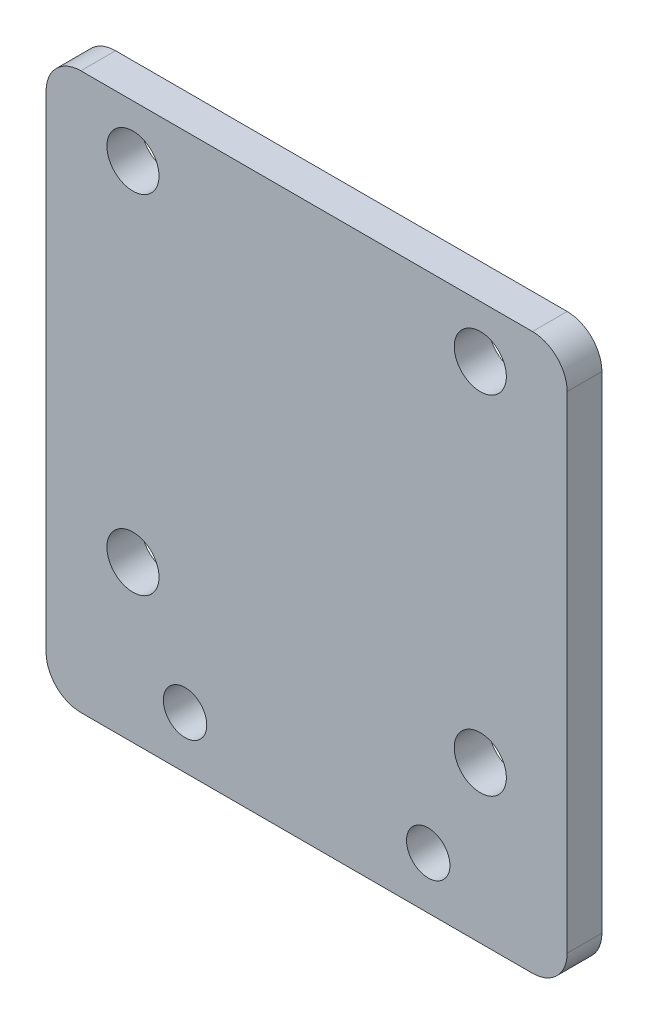
ISO-10303-21;
HEADER;
FILE_DESCRIPTION(('STEP AP214'),'2;1');
FILE_NAME('part.step','',(''),(''),'','','');
FILE_SCHEMA(('AUTOMOTIVE_DESIGN { 1 0 10303 214 1 1 1 1 }'));
ENDSEC;
DATA;
#1=APPLICATION_CONTEXT('core data for automotive mechanical design processes');
#2=APPLICATION_PROTOCOL_DEFINITION('international standard','automotive_design',2000,#1);
#3=PRODUCT_CONTEXT('',#1,'mechanical');
#4=PRODUCT('Part','Part','',(#3));
#5=PRODUCT_RELATED_PRODUCT_CATEGORY('part','',(#4));
#6=PRODUCT_DEFINITION_FORMATION('','',#4);
#7=PRODUCT_DEFINITION_CONTEXT('part definition',#1,'design');
#8=PRODUCT_DEFINITION('design','',#6,#7);
#9=PRODUCT_DEFINITION_SHAPE('','',#8);
#10=(LENGTH_UNIT() NAMED_UNIT(*) SI_UNIT(.MILLI.,.METRE.));
#11=(NAMED_UNIT(*) PLANE_ANGLE_UNIT() SI_UNIT($,.RADIAN.));
#12=(NAMED_UNIT(*) SI_UNIT($,.STERADIAN.) SOLID_ANGLE_UNIT());
#13=UNCERTAINTY_MEASURE_WITH_UNIT(LENGTH_MEASURE(1.E-05),#10,'distance_accuracy_value','');
#14=(GEOMETRIC_REPRESENTATION_CONTEXT(3) GLOBAL_UNCERTAINTY_ASSIGNED_CONTEXT((#13)) GLOBAL_UNIT_ASSIGNED_CONTEXT((#10,
#11,#12)) REPRESENTATION_CONTEXT('',''));
#15=CARTESIAN_POINT('',(0.,0.,0.));
#16=DIRECTION('',(0.,0.,1.));
#17=DIRECTION('',(1.,0.,0.));
#18=AXIS2_PLACEMENT_3D('',#15,#16,#17);
#19=CARTESIAN_POINT('',(0.,0.,2.));
#20=DIRECTION('',(0.,0.,-1.));
#21=DIRECTION('',(-1.,0.,0.));
#22=AXIS2_PLACEMENT_3D('',#19,#20,#21);
#23=PLANE('',#22);
#24=DIRECTION('',(1.,0.,0.));
#25=VECTOR('',#24,1.);
#26=CARTESIAN_POINT('',(-15.,-16.,2.));
#27=LINE('',#26,#25);
#28=CARTESIAN_POINT('',(-13.,-16.,2.));
#29=VERTEX_POINT('',#28);
#30=CARTESIAN_POINT('',(13.,-16.,2.));
#31=VERTEX_POINT('',#30);
#32=EDGE_CURVE('E150',#29,#31,#27,.T.);
#33=ORIENTED_EDGE('',*,*,#32,.T.);
#34=CARTESIAN_POINT('',(13.,-14.,2.));
#35=DIRECTION('',(0.,0.,-1.));
#36=DIRECTION('',(-1.,0.,0.));
#37=AXIS2_PLACEMENT_3D('',#34,#35,#36);
#38=CIRCLE('',#37,2.);
#39=CARTESIAN_POINT('',(15.,-14.,2.));
#40=VERTEX_POINT('',#39);
#41=EDGE_CURVE('E179',#31,#40,#38,.F.);
#42=ORIENTED_EDGE('',*,*,#41,.T.);
#43=DIRECTION('',(0.,1.,0.));
#44=VECTOR('',#43,1.);
#45=CARTESIAN_POINT('',(15.,-16.,2.));
#46=LINE('',#45,#44);
#47=CARTESIAN_POINT('',(15.,14.,2.));
#48=VERTEX_POINT('',#47);
#49=EDGE_CURVE('E128',#40,#48,#46,.T.);
#50=ORIENTED_EDGE('',*,*,#49,.T.);
#51=CARTESIAN_POINT('',(13.,14.,2.));
#52=DIRECTION('',(0.,0.,-1.));
#53=DIRECTION('',(-1.,0.,0.));
#54=AXIS2_PLACEMENT_3D('',#51,#52,#53);
#55=CIRCLE('',#54,2.);
#56=CARTESIAN_POINT('',(13.,16.,2.));
#57=VERTEX_POINT('',#56);
#58=EDGE_CURVE('E173',#48,#57,#55,.F.);
#59=ORIENTED_EDGE('',*,*,#58,.T.);
#60=DIRECTION('',(-1.,0.,0.));
#61=VECTOR('',#60,1.);
#62=CARTESIAN_POINT('',(-15.,16.,2.));
#63=LINE('',#62,#61);
#64=CARTESIAN_POINT('',(-13.,16.,2.));
#65=VERTEX_POINT('',#64);
#66=EDGE_CURVE('E192',#57,#65,#63,.T.);
#67=ORIENTED_EDGE('',*,*,#66,.T.);
#68=CARTESIAN_POINT('',(-13.,14.,2.));
#69=DIRECTION('',(0.,0.,-1.));
#70=DIRECTION('',(-1.,0.,0.));
#71=AXIS2_PLACEMENT_3D('',#68,#69,#70);
#72=CIRCLE('',#71,2.);
#73=CARTESIAN_POINT('',(-15.,14.,2.));
#74=VERTEX_POINT('',#73);
#75=EDGE_CURVE('E62',#65,#74,#72,.F.);
#76=ORIENTED_EDGE('',*,*,#75,.T.);
#77=DIRECTION('',(0.,-1.,0.));
#78=VECTOR('',#77,1.);
#79=CARTESIAN_POINT('',(-15.,-16.,2.));
#80=LINE('',#79,#78);
#81=CARTESIAN_POINT('',(-15.,-14.,2.));
#82=VERTEX_POINT('',#81);
#83=EDGE_CURVE('E199',#74,#82,#80,.T.);
#84=ORIENTED_EDGE('',*,*,#83,.T.);
#85=CARTESIAN_POINT('',(-13.,-14.,2.));
#86=DIRECTION('',(0.,0.,-1.));
#87=DIRECTION('',(-1.,0.,0.));
#88=AXIS2_PLACEMENT_3D('',#85,#86,#87);
#89=CIRCLE('',#88,2.);
#90=EDGE_CURVE('E176',#82,#29,#89,.F.);
#91=ORIENTED_EDGE('',*,*,#90,.T.);
#92=EDGE_LOOP('',(#33,#42,#50,#59,#67,#76,#84,#91));
#93=FACE_BOUND('',#92,.T.);
#94=CARTESIAN_POINT('',(-7.,-13.,2.));
#95=DIRECTION('',(0.,0.,1.));
#96=DIRECTION('',(1.,0.,0.));
#97=AXIS2_PLACEMENT_3D('',#94,#95,#96);
#98=CIRCLE('',#97,1.25);
#99=CARTESIAN_POINT('',(-5.75,-13.,2.));
#100=VERTEX_POINT('',#99);
#101=EDGE_CURVE('E139',#100,#100,#98,.T.);
#102=ORIENTED_EDGE('',*,*,#101,.F.);
#103=EDGE_LOOP('',(#102));
#104=FACE_BOUND('',#103,.T.);
#105=CARTESIAN_POINT('',(6.99999999999999,-13.,2.));
#106=DIRECTION('',(0.,0.,1.));
#107=DIRECTION('',(1.,0.,0.));
#108=AXIS2_PLACEMENT_3D('',#105,#106,#107);
#109=CIRCLE('',#108,1.25);
#110=CARTESIAN_POINT('',(8.24999999999999,-13.,2.));
#111=VERTEX_POINT('',#110);
#112=EDGE_CURVE('E218',#111,#111,#109,.T.);
#113=ORIENTED_EDGE('',*,*,#112,.F.);
#114=EDGE_LOOP('',(#113));
#115=FACE_BOUND('',#114,.T.);
#116=CARTESIAN_POINT('',(-10.,-7.,2.));
#117=DIRECTION('',(0.,0.,1.));
#118=DIRECTION('',(1.,0.,0.));
#119=AXIS2_PLACEMENT_3D('',#116,#117,#118);
#120=CIRCLE('',#119,1.5);
#121=CARTESIAN_POINT('',(-8.5,-7.,2.));
#122=VERTEX_POINT('',#121);
#123=EDGE_CURVE('E224',#122,#122,#120,.T.);
#124=ORIENTED_EDGE('',*,*,#123,.F.);
#125=EDGE_LOOP('',(#124));
#126=FACE_BOUND('',#125,.T.);
#127=CARTESIAN_POINT('',(-10.,13.,2.));
#128=DIRECTION('',(0.,0.,1.));
#129=DIRECTION('',(1.,0.,0.));
#130=AXIS2_PLACEMENT_3D('',#127,#128,#129);
#131=CIRCLE('',#130,1.5);
#132=CARTESIAN_POINT('',(-8.5,13.,2.));
#133=VERTEX_POINT('',#132);
#134=EDGE_CURVE('E232',#133,#133,#131,.T.);
#135=ORIENTED_EDGE('',*,*,#134,.F.);
#136=EDGE_LOOP('',(#135));
#137=FACE_BOUND('',#136,.T.);
#138=CARTESIAN_POINT('',(9.99999999999999,13.,2.));
#139=DIRECTION('',(0.,0.,1.));
#140=DIRECTION('',(1.,0.,0.));
#141=AXIS2_PLACEMENT_3D('',#138,#139,#140);
#142=CIRCLE('',#141,1.5);
#143=CARTESIAN_POINT('',(11.5,13.,2.));
#144=VERTEX_POINT('',#143);
#145=EDGE_CURVE('E240',#144,#144,#142,.T.);
#146=ORIENTED_EDGE('',*,*,#145,.F.);
#147=EDGE_LOOP('',(#146));
#148=FACE_BOUND('',#147,.T.);
#149=CARTESIAN_POINT('',(9.99999999999999,-7.,2.));
#150=DIRECTION('',(0.,0.,1.));
#151=DIRECTION('',(1.,0.,0.));
#152=AXIS2_PLACEMENT_3D('',#149,#150,#151);
#153=CIRCLE('',#152,1.5);
#154=CARTESIAN_POINT('',(11.5,-7.,2.));
#155=VERTEX_POINT('',#154);
#156=EDGE_CURVE('E248',#155,#155,#153,.T.);
#157=ORIENTED_EDGE('',*,*,#156,.F.);
#158=EDGE_LOOP('',(#157));
#159=FACE_BOUND('',#158,.T.);
#160=ADVANCED_FACE('F39',(#93,#104,#115,#126,#137,#148,#159),#23,.F.);
#161=CARTESIAN_POINT('',(0.,0.,0.));
#162=DIRECTION('',(0.,0.,-1.));
#163=DIRECTION('',(-1.,0.,0.));
#164=AXIS2_PLACEMENT_3D('',#161,#162,#163);
#165=PLANE('',#164);
#166=CARTESIAN_POINT('',(9.99999999999999,13.,0.));
#167=DIRECTION('',(0.,0.,1.));
#168=DIRECTION('',(1.,0.,0.));
#169=AXIS2_PLACEMENT_3D('',#166,#167,#168);
#170=CIRCLE('',#169,1.5);
#171=CARTESIAN_POINT('',(11.5,13.,0.));
#172=VERTEX_POINT('',#171);
#173=EDGE_CURVE('E244',#172,#172,#170,.T.);
#174=ORIENTED_EDGE('',*,*,#173,.T.);
#175=EDGE_LOOP('',(#174));
#176=FACE_BOUND('',#175,.T.);
#177=CARTESIAN_POINT('',(-10.,-7.,0.));
#178=DIRECTION('',(0.,0.,1.));
#179=DIRECTION('',(1.,0.,0.));
#180=AXIS2_PLACEMENT_3D('',#177,#178,#179);
#181=CIRCLE('',#180,1.5);
#182=CARTESIAN_POINT('',(-8.5,-7.,0.));
#183=VERTEX_POINT('',#182);
#184=EDGE_CURVE('E228',#183,#183,#181,.T.);
#185=ORIENTED_EDGE('',*,*,#184,.T.);
#186=EDGE_LOOP('',(#185));
#187=FACE_BOUND('',#186,.T.);
#188=CARTESIAN_POINT('',(-7.,-13.,0.));
#189=DIRECTION('',(0.,0.,1.));
#190=DIRECTION('',(1.,0.,0.));
#191=AXIS2_PLACEMENT_3D('',#188,#189,#190);
#192=CIRCLE('',#191,1.25);
#193=CARTESIAN_POINT('',(-5.75,-13.,0.));
#194=VERTEX_POINT('',#193);
#195=EDGE_CURVE('E147',#194,#194,#192,.T.);
#196=ORIENTED_EDGE('',*,*,#195,.T.);
#197=EDGE_LOOP('',(#196));
#198=FACE_BOUND('',#197,.T.);
#199=DIRECTION('',(0.,1.,0.));
#200=VECTOR('',#199,1.);
#201=CARTESIAN_POINT('',(15.,-16.,0.));
#202=LINE('',#201,#200);
#203=CARTESIAN_POINT('',(15.,-14.,0.));
#204=VERTEX_POINT('',#203);
#205=CARTESIAN_POINT('',(15.,14.,0.));
#206=VERTEX_POINT('',#205);
#207=EDGE_CURVE('E125',#204,#206,#202,.T.);
#208=ORIENTED_EDGE('',*,*,#207,.F.);
#209=CARTESIAN_POINT('',(13.,-14.,0.));
#210=DIRECTION('',(0.,0.,-1.));
#211=DIRECTION('',(-1.,0.,0.));
#212=AXIS2_PLACEMENT_3D('',#209,#210,#211);
#213=CIRCLE('',#212,2.);
#214=CARTESIAN_POINT('',(13.,-16.,0.));
#215=VERTEX_POINT('',#214);
#216=EDGE_CURVE('E107',#204,#215,#213,.T.);
#217=ORIENTED_EDGE('',*,*,#216,.T.);
#218=DIRECTION('',(1.,0.,0.));
#219=VECTOR('',#218,1.);
#220=CARTESIAN_POINT('',(-15.,-16.,0.));
#221=LINE('',#220,#219);
#222=CARTESIAN_POINT('',(-13.,-16.,0.));
#223=VERTEX_POINT('',#222);
#224=EDGE_CURVE('E155',#223,#215,#221,.T.);
#225=ORIENTED_EDGE('',*,*,#224,.F.);
#226=CARTESIAN_POINT('',(-13.,-14.,0.));
#227=DIRECTION('',(0.,0.,-1.));
#228=DIRECTION('',(-1.,0.,0.));
#229=AXIS2_PLACEMENT_3D('',#226,#227,#228);
#230=CIRCLE('',#229,2.);
#231=CARTESIAN_POINT('',(-15.,-14.,0.));
#232=VERTEX_POINT('',#231);
#233=EDGE_CURVE('E119',#223,#232,#230,.T.);
#234=ORIENTED_EDGE('',*,*,#233,.T.);
#235=DIRECTION('',(0.,-1.,0.));
#236=VECTOR('',#235,1.);
#237=CARTESIAN_POINT('',(-15.,-16.,0.));
#238=LINE('',#237,#236);
#239=CARTESIAN_POINT('',(-15.,14.,0.));
#240=VERTEX_POINT('',#239);
#241=EDGE_CURVE('E144',#240,#232,#238,.T.);
#242=ORIENTED_EDGE('',*,*,#241,.F.);
#243=CARTESIAN_POINT('',(-13.,14.,0.));
#244=DIRECTION('',(0.,0.,-1.));
#245=DIRECTION('',(-1.,0.,0.));
#246=AXIS2_PLACEMENT_3D('',#243,#244,#245);
#247=CIRCLE('',#246,2.);
#248=CARTESIAN_POINT('',(-13.,16.,0.));
#249=VERTEX_POINT('',#248);
#250=EDGE_CURVE('E130',#240,#249,#247,.T.);
#251=ORIENTED_EDGE('',*,*,#250,.T.);
#252=DIRECTION('',(-1.,0.,0.));
#253=VECTOR('',#252,1.);
#254=CARTESIAN_POINT('',(-15.,16.,0.));
#255=LINE('',#254,#253);
#256=CARTESIAN_POINT('',(13.,16.,0.));
#257=VERTEX_POINT('',#256);
#258=EDGE_CURVE('E138',#257,#249,#255,.T.);
#259=ORIENTED_EDGE('',*,*,#258,.F.);
#260=CARTESIAN_POINT('',(13.,14.,0.));
#261=DIRECTION('',(0.,0.,-1.));
#262=DIRECTION('',(-1.,0.,0.));
#263=AXIS2_PLACEMENT_3D('',#260,#261,#262);
#264=CIRCLE('',#263,2.);
#265=EDGE_CURVE('E136',#257,#206,#264,.T.);
#266=ORIENTED_EDGE('',*,*,#265,.T.);
#267=EDGE_LOOP('',(#208,#217,#225,#234,#242,#251,#259,#266));
#268=FACE_BOUND('',#267,.T.);
#269=CARTESIAN_POINT('',(6.99999999999999,-13.,0.));
#270=DIRECTION('',(0.,0.,1.));
#271=DIRECTION('',(1.,0.,0.));
#272=AXIS2_PLACEMENT_3D('',#269,#270,#271);
#273=CIRCLE('',#272,1.25);
#274=CARTESIAN_POINT('',(8.24999999999999,-13.,0.));
#275=VERTEX_POINT('',#274);
#276=EDGE_CURVE('E220',#275,#275,#273,.T.);
#277=ORIENTED_EDGE('',*,*,#276,.T.);
#278=EDGE_LOOP('',(#277));
#279=FACE_BOUND('',#278,.T.);
#280=CARTESIAN_POINT('',(-10.,13.,0.));
#281=DIRECTION('',(0.,0.,1.));
#282=DIRECTION('',(1.,0.,0.));
#283=AXIS2_PLACEMENT_3D('',#280,#281,#282);
#284=CIRCLE('',#283,1.5);
#285=CARTESIAN_POINT('',(-8.5,13.,0.));
#286=VERTEX_POINT('',#285);
#287=EDGE_CURVE('E236',#286,#286,#284,.T.);
#288=ORIENTED_EDGE('',*,*,#287,.T.);
#289=EDGE_LOOP('',(#288));
#290=FACE_BOUND('',#289,.T.);
#291=CARTESIAN_POINT('',(9.99999999999999,-7.,0.));
#292=DIRECTION('',(0.,0.,1.));
#293=DIRECTION('',(1.,0.,0.));
#294=AXIS2_PLACEMENT_3D('',#291,#292,#293);
#295=CIRCLE('',#294,1.5);
#296=CARTESIAN_POINT('',(11.5,-7.,0.));
#297=VERTEX_POINT('',#296);
#298=EDGE_CURVE('E252',#297,#297,#295,.T.);
#299=ORIENTED_EDGE('',*,*,#298,.T.);
#300=EDGE_LOOP('',(#299));
#301=FACE_BOUND('',#300,.T.);
#302=ADVANCED_FACE('F133',(#176,#187,#198,#268,#279,#290,#301),#165,.T.);
#303=CARTESIAN_POINT('',(15.,-16.,2.));
#304=DIRECTION('',(-1.,0.,0.));
#305=DIRECTION('',(0.,0.,1.));
#306=AXIS2_PLACEMENT_3D('',#303,#304,#305);
#307=PLANE('',#306);
#308=ORIENTED_EDGE('',*,*,#49,.F.);
#309=DIRECTION('',(0.,0.,-1.));
#310=VECTOR('',#309,1.);
#311=CARTESIAN_POINT('',(15.,-14.,2.));
#312=LINE('',#311,#310);
#313=EDGE_CURVE('E111',#40,#204,#312,.T.);
#314=ORIENTED_EDGE('',*,*,#313,.T.);
#315=ORIENTED_EDGE('',*,*,#207,.T.);
#316=DIRECTION('',(0.,0.,-1.));
#317=VECTOR('',#316,1.);
#318=CARTESIAN_POINT('',(15.,14.,2.));
#319=LINE('',#318,#317);
#320=EDGE_CURVE('E131',#206,#48,#319,.F.);
#321=ORIENTED_EDGE('',*,*,#320,.T.);
#322=EDGE_LOOP('',(#308,#314,#315,#321));
#323=FACE_BOUND('',#322,.T.);
#324=ADVANCED_FACE('F124',(#323),#307,.F.);
#325=CARTESIAN_POINT('',(-15.,16.,2.));
#326=DIRECTION('',(0.,-1.,0.));
#327=DIRECTION('',(0.,0.,-1.));
#328=AXIS2_PLACEMENT_3D('',#325,#326,#327);
#329=PLANE('',#328);
#330=ORIENTED_EDGE('',*,*,#66,.F.);
#331=DIRECTION('',(0.,0.,-1.));
#332=VECTOR('',#331,1.);
#333=CARTESIAN_POINT('',(13.,16.,2.));
#334=LINE('',#333,#332);
#335=EDGE_CURVE('E11',#57,#257,#334,.T.);
#336=ORIENTED_EDGE('',*,*,#335,.T.);
#337=ORIENTED_EDGE('',*,*,#258,.T.);
#338=DIRECTION('',(0.,0.,-1.));
#339=VECTOR('',#338,1.);
#340=CARTESIAN_POINT('',(-13.,16.,2.));
#341=LINE('',#340,#339);
#342=EDGE_CURVE('E48',#249,#65,#341,.F.);
#343=ORIENTED_EDGE('',*,*,#342,.T.);
#344=EDGE_LOOP('',(#330,#336,#337,#343));
#345=FACE_BOUND('',#344,.T.);
#346=ADVANCED_FACE('F191',(#345),#329,.F.);
#347=CARTESIAN_POINT('',(-15.,-16.,2.));
#348=DIRECTION('',(1.,0.,0.));
#349=DIRECTION('',(0.,0.,-1.));
#350=AXIS2_PLACEMENT_3D('',#347,#348,#349);
#351=PLANE('',#350);
#352=ORIENTED_EDGE('',*,*,#241,.T.);
#353=DIRECTION('',(0.,0.,-1.));
#354=VECTOR('',#353,1.);
#355=CARTESIAN_POINT('',(-15.,-14.,2.));
#356=LINE('',#355,#354);
#357=EDGE_CURVE('E55',#232,#82,#356,.F.);
#358=ORIENTED_EDGE('',*,*,#357,.T.);
#359=ORIENTED_EDGE('',*,*,#83,.F.);
#360=DIRECTION('',(0.,0.,-1.));
#361=VECTOR('',#360,1.);
#362=CARTESIAN_POINT('',(-15.,14.,2.));
#363=LINE('',#362,#361);
#364=EDGE_CURVE('E182',#74,#240,#363,.T.);
#365=ORIENTED_EDGE('',*,*,#364,.T.);
#366=EDGE_LOOP('',(#352,#358,#359,#365));
#367=FACE_BOUND('',#366,.T.);
#368=ADVANCED_FACE('F203',(#367),#351,.F.);
#369=CARTESIAN_POINT('',(-15.,-16.,2.));
#370=DIRECTION('',(0.,1.,0.));
#371=DIRECTION('',(0.,0.,1.));
#372=AXIS2_PLACEMENT_3D('',#369,#370,#371);
#373=PLANE('',#372);
#374=ORIENTED_EDGE('',*,*,#224,.T.);
#375=DIRECTION('',(0.,0.,-1.));
#376=VECTOR('',#375,1.);
#377=CARTESIAN_POINT('',(13.,-16.,2.));
#378=LINE('',#377,#376);
#379=EDGE_CURVE('E112',#215,#31,#378,.F.);
#380=ORIENTED_EDGE('',*,*,#379,.T.);
#381=ORIENTED_EDGE('',*,*,#32,.F.);
#382=DIRECTION('',(0.,0.,-1.));
#383=VECTOR('',#382,1.);
#384=CARTESIAN_POINT('',(-13.,-16.,2.));
#385=LINE('',#384,#383);
#386=EDGE_CURVE('E118',#29,#223,#385,.T.);
#387=ORIENTED_EDGE('',*,*,#386,.T.);
#388=EDGE_LOOP('',(#374,#380,#381,#387));
#389=FACE_BOUND('',#388,.T.);
#390=ADVANCED_FACE('F210',(#389),#373,.F.);
#391=CARTESIAN_POINT('',(-7.,-13.,2.));
#392=DIRECTION('',(0.,0.,-1.));
#393=DIRECTION('',(-1.,0.,0.));
#394=AXIS2_PLACEMENT_3D('',#391,#392,#393);
#395=CYLINDRICAL_SURFACE('',#394,1.25);
#396=ORIENTED_EDGE('',*,*,#101,.T.);
#397=EDGE_LOOP('',(#396));
#398=FACE_BOUND('',#397,.T.);
#399=ORIENTED_EDGE('',*,*,#195,.F.);
#400=EDGE_LOOP('',(#399));
#401=FACE_BOUND('',#400,.T.);
#402=ADVANCED_FACE('F271',(#398,#401),#395,.F.);
#403=CARTESIAN_POINT('',(6.99999999999999,-13.,2.));
#404=DIRECTION('',(0.,0.,-1.));
#405=DIRECTION('',(-1.,0.,0.));
#406=AXIS2_PLACEMENT_3D('',#403,#404,#405);
#407=CYLINDRICAL_SURFACE('',#406,1.25);
#408=ORIENTED_EDGE('',*,*,#112,.T.);
#409=EDGE_LOOP('',(#408));
#410=FACE_BOUND('',#409,.T.);
#411=ORIENTED_EDGE('',*,*,#276,.F.);
#412=EDGE_LOOP('',(#411));
#413=FACE_BOUND('',#412,.T.);
#414=ADVANCED_FACE('F383',(#410,#413),#407,.F.);
#415=CARTESIAN_POINT('',(-10.,-7.,2.));
#416=DIRECTION('',(0.,0.,-1.));
#417=DIRECTION('',(-1.,0.,0.));
#418=AXIS2_PLACEMENT_3D('',#415,#416,#417);
#419=CYLINDRICAL_SURFACE('',#418,1.5);
#420=ORIENTED_EDGE('',*,*,#123,.T.);
#421=EDGE_LOOP('',(#420));
#422=FACE_BOUND('',#421,.T.);
#423=ORIENTED_EDGE('',*,*,#184,.F.);
#424=EDGE_LOOP('',(#423));
#425=FACE_BOUND('',#424,.T.);
#426=ADVANCED_FACE('F373',(#422,#425),#419,.F.);
#427=CARTESIAN_POINT('',(-10.,13.,2.));
#428=DIRECTION('',(0.,0.,-1.));
#429=DIRECTION('',(-1.,0.,0.));
#430=AXIS2_PLACEMENT_3D('',#427,#428,#429);
#431=CYLINDRICAL_SURFACE('',#430,1.5);
#432=ORIENTED_EDGE('',*,*,#134,.T.);
#433=EDGE_LOOP('',(#432));
#434=FACE_BOUND('',#433,.T.);
#435=ORIENTED_EDGE('',*,*,#287,.F.);
#436=EDGE_LOOP('',(#435));
#437=FACE_BOUND('',#436,.T.);
#438=ADVANCED_FACE('F363',(#434,#437),#431,.F.);
#439=CARTESIAN_POINT('',(9.99999999999999,13.,2.));
#440=DIRECTION('',(0.,0.,-1.));
#441=DIRECTION('',(-1.,0.,0.));
#442=AXIS2_PLACEMENT_3D('',#439,#440,#441);
#443=CYLINDRICAL_SURFACE('',#442,1.5);
#444=ORIENTED_EDGE('',*,*,#145,.T.);
#445=EDGE_LOOP('',(#444));
#446=FACE_BOUND('',#445,.T.);
#447=ORIENTED_EDGE('',*,*,#173,.F.);
#448=EDGE_LOOP('',(#447));
#449=FACE_BOUND('',#448,.T.);
#450=ADVANCED_FACE('F354',(#446,#449),#443,.F.);
#451=CARTESIAN_POINT('',(9.99999999999999,-7.,2.));
#452=DIRECTION('',(0.,0.,-1.));
#453=DIRECTION('',(-1.,0.,0.));
#454=AXIS2_PLACEMENT_3D('',#451,#452,#453);
#455=CYLINDRICAL_SURFACE('',#454,1.5);
#456=ORIENTED_EDGE('',*,*,#156,.T.);
#457=EDGE_LOOP('',(#456));
#458=FACE_BOUND('',#457,.T.);
#459=ORIENTED_EDGE('',*,*,#298,.F.);
#460=EDGE_LOOP('',(#459));
#461=FACE_BOUND('',#460,.T.);
#462=ADVANCED_FACE('F260',(#458,#461),#455,.F.);
#463=CARTESIAN_POINT('',(13.,-14.,2.));
#464=DIRECTION('',(0.,0.,-1.));
#465=DIRECTION('',(-1.,0.,0.));
#466=AXIS2_PLACEMENT_3D('',#463,#464,#465);
#467=CYLINDRICAL_SURFACE('',#466,2.);
#468=ORIENTED_EDGE('',*,*,#41,.F.);
#469=ORIENTED_EDGE('',*,*,#379,.F.);
#470=ORIENTED_EDGE('',*,*,#216,.F.);
#471=ORIENTED_EDGE('',*,*,#313,.F.);
#472=EDGE_LOOP('',(#468,#469,#470,#471));
#473=FACE_BOUND('',#472,.T.);
#474=ADVANCED_FACE('F110',(#473),#467,.T.);
#475=CARTESIAN_POINT('',(-13.,-14.,2.));
#476=DIRECTION('',(0.,0.,-1.));
#477=DIRECTION('',(-1.,0.,0.));
#478=AXIS2_PLACEMENT_3D('',#475,#476,#477);
#479=CYLINDRICAL_SURFACE('',#478,2.);
#480=ORIENTED_EDGE('',*,*,#90,.F.);
#481=ORIENTED_EDGE('',*,*,#357,.F.);
#482=ORIENTED_EDGE('',*,*,#233,.F.);
#483=ORIENTED_EDGE('',*,*,#386,.F.);
#484=EDGE_LOOP('',(#480,#481,#482,#483));
#485=FACE_BOUND('',#484,.T.);
#486=ADVANCED_FACE('F207',(#485),#479,.T.);
#487=CARTESIAN_POINT('',(13.,14.,2.));
#488=DIRECTION('',(0.,0.,-1.));
#489=DIRECTION('',(-1.,0.,0.));
#490=AXIS2_PLACEMENT_3D('',#487,#488,#489);
#491=CYLINDRICAL_SURFACE('',#490,2.);
#492=ORIENTED_EDGE('',*,*,#58,.F.);
#493=ORIENTED_EDGE('',*,*,#320,.F.);
#494=ORIENTED_EDGE('',*,*,#265,.F.);
#495=ORIENTED_EDGE('',*,*,#335,.F.);
#496=EDGE_LOOP('',(#492,#493,#494,#495));
#497=FACE_BOUND('',#496,.T.);
#498=ADVANCED_FACE('F285',(#497),#491,.T.);
#499=CARTESIAN_POINT('',(-13.,14.,2.));
#500=DIRECTION('',(0.,0.,-1.));
#501=DIRECTION('',(-1.,0.,0.));
#502=AXIS2_PLACEMENT_3D('',#499,#500,#501);
#503=CYLINDRICAL_SURFACE('',#502,2.);
#504=ORIENTED_EDGE('',*,*,#75,.F.);
#505=ORIENTED_EDGE('',*,*,#342,.F.);
#506=ORIENTED_EDGE('',*,*,#250,.F.);
#507=ORIENTED_EDGE('',*,*,#364,.F.);
#508=EDGE_LOOP('',(#504,#505,#506,#507));
#509=FACE_BOUND('',#508,.T.);
#510=ADVANCED_FACE('F41',(#509),#503,.T.);
#511=CLOSED_SHELL('',(#160,#302,#324,#346,#368,#390,#402,#414,#426,#438,#450,#462,#474,#486,
#498,#510));
#512=MANIFOLD_SOLID_BREP('B2',#511);
#513=ADVANCED_BREP_SHAPE_REPRESENTATION('',(#18,#512),#14);
#514=SHAPE_DEFINITION_REPRESENTATION(#9,#513);
ENDSEC;
END-ISO-10303-21;
